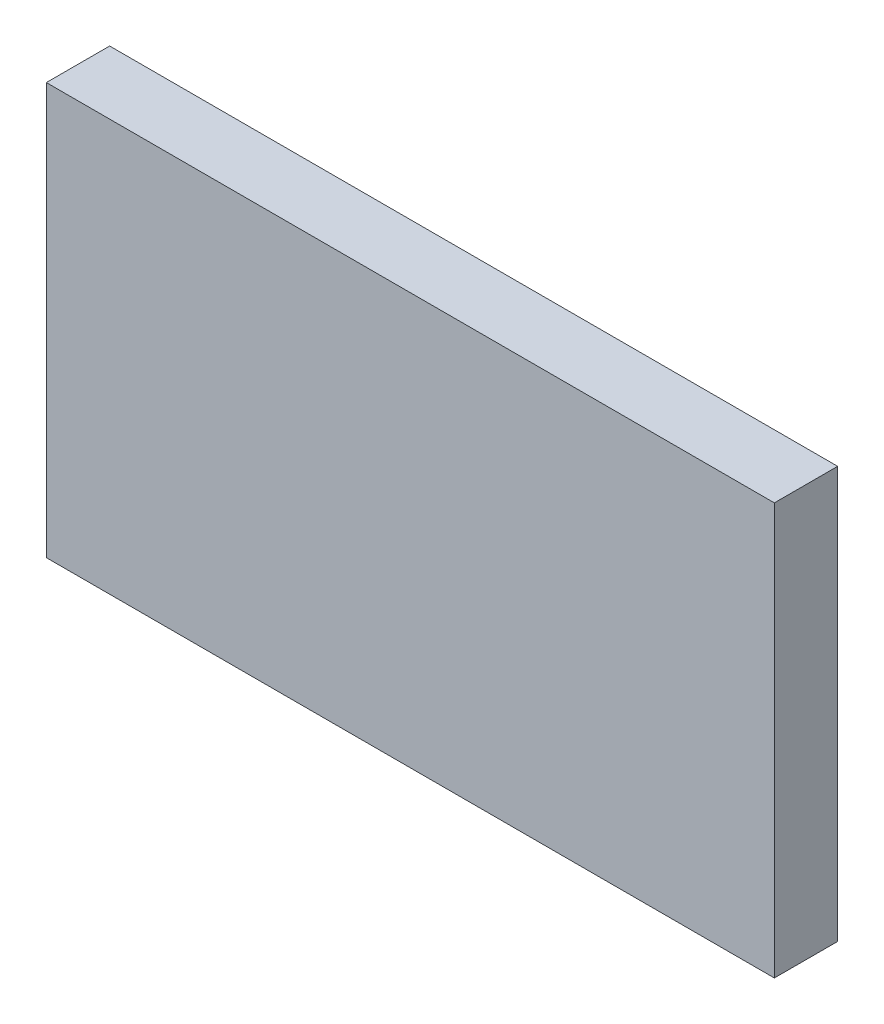
ISO-10303-21;
HEADER;
FILE_DESCRIPTION(('STEP AP214'),'2;1');
FILE_NAME('part.step','',(''),(''),'','','');
FILE_SCHEMA(('AUTOMOTIVE_DESIGN { 1 0 10303 214 1 1 1 1 }'));
ENDSEC;
DATA;
#1=APPLICATION_CONTEXT('core data for automotive mechanical design processes');
#2=APPLICATION_PROTOCOL_DEFINITION('international standard','automotive_design',2000,#1);
#3=PRODUCT_CONTEXT('',#1,'mechanical');
#4=PRODUCT('Part','Part','',(#3));
#5=PRODUCT_RELATED_PRODUCT_CATEGORY('part','',(#4));
#6=PRODUCT_DEFINITION_FORMATION('','',#4);
#7=PRODUCT_DEFINITION_CONTEXT('part definition',#1,'design');
#8=PRODUCT_DEFINITION('design','',#6,#7);
#9=PRODUCT_DEFINITION_SHAPE('','',#8);
#10=(LENGTH_UNIT() NAMED_UNIT(*) SI_UNIT(.MILLI.,.METRE.));
#11=(NAMED_UNIT(*) PLANE_ANGLE_UNIT() SI_UNIT($,.RADIAN.));
#12=(NAMED_UNIT(*) SI_UNIT($,.STERADIAN.) SOLID_ANGLE_UNIT());
#13=UNCERTAINTY_MEASURE_WITH_UNIT(LENGTH_MEASURE(1.E-05),#10,'distance_accuracy_value','');
#14=(GEOMETRIC_REPRESENTATION_CONTEXT(3) GLOBAL_UNCERTAINTY_ASSIGNED_CONTEXT((#13)) GLOBAL_UNIT_ASSIGNED_CONTEXT((#10,
#11,#12)) REPRESENTATION_CONTEXT('',''));
#15=CARTESIAN_POINT('',(0.,0.,0.));
#16=DIRECTION('',(0.,0.,1.));
#17=DIRECTION('',(1.,0.,0.));
#18=AXIS2_PLACEMENT_3D('',#15,#16,#17);
#19=CARTESIAN_POINT('',(11.5,-6.5,2.));
#20=DIRECTION('',(-1.,0.,0.));
#21=DIRECTION('',(0.,0.,1.));
#22=AXIS2_PLACEMENT_3D('',#19,#20,#21);
#23=PLANE('',#22);
#24=DIRECTION('',(0.,1.,0.));
#25=VECTOR('',#24,1.);
#26=CARTESIAN_POINT('',(11.5,-6.5,0.));
#27=LINE('',#26,#25);
#28=CARTESIAN_POINT('',(11.5,-6.5,0.));
#29=VERTEX_POINT('',#28);
#30=CARTESIAN_POINT('',(11.5,6.5,0.));
#31=VERTEX_POINT('',#30);
#32=EDGE_CURVE('E102',#29,#31,#27,.T.);
#33=ORIENTED_EDGE('',*,*,#32,.T.);
#34=DIRECTION('',(0.,0.,-1.));
#35=VECTOR('',#34,1.);
#36=CARTESIAN_POINT('',(11.5,6.5,2.));
#37=LINE('',#36,#35);
#38=CARTESIAN_POINT('',(11.5,6.5,2.));
#39=VERTEX_POINT('',#38);
#40=EDGE_CURVE('E11',#39,#31,#37,.T.);
#41=ORIENTED_EDGE('',*,*,#40,.F.);
#42=DIRECTION('',(0.,1.,0.));
#43=VECTOR('',#42,1.);
#44=CARTESIAN_POINT('',(11.5,-6.5,2.));
#45=LINE('',#44,#43);
#46=CARTESIAN_POINT('',(11.5,-6.5,2.));
#47=VERTEX_POINT('',#46);
#48=EDGE_CURVE('E90',#47,#39,#45,.T.);
#49=ORIENTED_EDGE('',*,*,#48,.F.);
#50=DIRECTION('',(0.,0.,-1.));
#51=VECTOR('',#50,1.);
#52=CARTESIAN_POINT('',(11.5,-6.5,2.));
#53=LINE('',#52,#51);
#54=EDGE_CURVE('E98',#47,#29,#53,.T.);
#55=ORIENTED_EDGE('',*,*,#54,.T.);
#56=EDGE_LOOP('',(#33,#41,#49,#55));
#57=FACE_BOUND('',#56,.T.);
#58=ADVANCED_FACE('F39',(#57),#23,.F.);
#59=CARTESIAN_POINT('',(-11.5,6.5,2.));
#60=DIRECTION('',(0.,-1.,0.));
#61=DIRECTION('',(0.,0.,-1.));
#62=AXIS2_PLACEMENT_3D('',#59,#60,#61);
#63=PLANE('',#62);
#64=DIRECTION('',(-1.,0.,0.));
#65=VECTOR('',#64,1.);
#66=CARTESIAN_POINT('',(-11.5,6.5,0.));
#67=LINE('',#66,#65);
#68=CARTESIAN_POINT('',(-11.5,6.5,0.));
#69=VERTEX_POINT('',#68);
#70=EDGE_CURVE('E94',#31,#69,#67,.T.);
#71=ORIENTED_EDGE('',*,*,#70,.T.);
#72=DIRECTION('',(0.,0.,-1.));
#73=VECTOR('',#72,1.);
#74=CARTESIAN_POINT('',(-11.5,6.5,2.));
#75=LINE('',#74,#73);
#76=CARTESIAN_POINT('',(-11.5,6.5,2.));
#77=VERTEX_POINT('',#76);
#78=EDGE_CURVE('E47',#77,#69,#75,.T.);
#79=ORIENTED_EDGE('',*,*,#78,.F.);
#80=DIRECTION('',(-1.,0.,0.));
#81=VECTOR('',#80,1.);
#82=CARTESIAN_POINT('',(-11.5,6.5,2.));
#83=LINE('',#82,#81);
#84=EDGE_CURVE('E85',#39,#77,#83,.T.);
#85=ORIENTED_EDGE('',*,*,#84,.F.);
#86=ORIENTED_EDGE('',*,*,#40,.T.);
#87=EDGE_LOOP('',(#71,#79,#85,#86));
#88=FACE_BOUND('',#87,.T.);
#89=ADVANCED_FACE('F93',(#88),#63,.F.);
#90=CARTESIAN_POINT('',(-11.5,-6.5,2.));
#91=DIRECTION('',(1.,0.,0.));
#92=DIRECTION('',(0.,0.,-1.));
#93=AXIS2_PLACEMENT_3D('',#90,#91,#92);
#94=PLANE('',#93);
#95=DIRECTION('',(0.,-1.,0.));
#96=VECTOR('',#95,1.);
#97=CARTESIAN_POINT('',(-11.5,-6.5,0.));
#98=LINE('',#97,#96);
#99=CARTESIAN_POINT('',(-11.5,-6.5,0.));
#100=VERTEX_POINT('',#99);
#101=EDGE_CURVE('E72',#69,#100,#98,.T.);
#102=ORIENTED_EDGE('',*,*,#101,.T.);
#103=DIRECTION('',(0.,0.,-1.));
#104=VECTOR('',#103,1.);
#105=CARTESIAN_POINT('',(-11.5,-6.5,2.));
#106=LINE('',#105,#104);
#107=CARTESIAN_POINT('',(-11.5,-6.5,2.));
#108=VERTEX_POINT('',#107);
#109=EDGE_CURVE('E95',#108,#100,#106,.T.);
#110=ORIENTED_EDGE('',*,*,#109,.F.);
#111=DIRECTION('',(0.,-1.,0.));
#112=VECTOR('',#111,1.);
#113=CARTESIAN_POINT('',(-11.5,-6.5,2.));
#114=LINE('',#113,#112);
#115=EDGE_CURVE('E88',#77,#108,#114,.T.);
#116=ORIENTED_EDGE('',*,*,#115,.F.);
#117=ORIENTED_EDGE('',*,*,#78,.T.);
#118=EDGE_LOOP('',(#102,#110,#116,#117));
#119=FACE_BOUND('',#118,.T.);
#120=ADVANCED_FACE('F96',(#119),#94,.F.);
#121=CARTESIAN_POINT('',(-11.5,-6.5,2.));
#122=DIRECTION('',(0.,1.,0.));
#123=DIRECTION('',(0.,0.,1.));
#124=AXIS2_PLACEMENT_3D('',#121,#122,#123);
#125=PLANE('',#124);
#126=DIRECTION('',(1.,0.,0.));
#127=VECTOR('',#126,1.);
#128=CARTESIAN_POINT('',(-11.5,-6.5,0.));
#129=LINE('',#128,#127);
#130=EDGE_CURVE('E78',#100,#29,#129,.T.);
#131=ORIENTED_EDGE('',*,*,#130,.T.);
#132=ORIENTED_EDGE('',*,*,#54,.F.);
#133=DIRECTION('',(1.,0.,0.));
#134=VECTOR('',#133,1.);
#135=CARTESIAN_POINT('',(-11.5,-6.5,2.));
#136=LINE('',#135,#134);
#137=EDGE_CURVE('E55',#108,#47,#136,.T.);
#138=ORIENTED_EDGE('',*,*,#137,.F.);
#139=ORIENTED_EDGE('',*,*,#109,.T.);
#140=EDGE_LOOP('',(#131,#132,#138,#139));
#141=FACE_BOUND('',#140,.T.);
#142=ADVANCED_FACE('F109',(#141),#125,.F.);
#143=CARTESIAN_POINT('',(0.,0.,2.));
#144=DIRECTION('',(0.,0.,-1.));
#145=DIRECTION('',(-1.,0.,0.));
#146=AXIS2_PLACEMENT_3D('',#143,#144,#145);
#147=PLANE('',#146);
#148=ORIENTED_EDGE('',*,*,#48,.T.);
#149=ORIENTED_EDGE('',*,*,#84,.T.);
#150=ORIENTED_EDGE('',*,*,#115,.T.);
#151=ORIENTED_EDGE('',*,*,#137,.T.);
#152=EDGE_LOOP('',(#148,#149,#150,#151));
#153=FACE_BOUND('',#152,.T.);
#154=ADVANCED_FACE('F86',(#153),#147,.F.);
#155=CARTESIAN_POINT('',(0.,0.,0.));
#156=DIRECTION('',(0.,0.,-1.));
#157=DIRECTION('',(-1.,0.,0.));
#158=AXIS2_PLACEMENT_3D('',#155,#156,#157);
#159=PLANE('',#158);
#160=ORIENTED_EDGE('',*,*,#32,.F.);
#161=ORIENTED_EDGE('',*,*,#130,.F.);
#162=ORIENTED_EDGE('',*,*,#101,.F.);
#163=ORIENTED_EDGE('',*,*,#70,.F.);
#164=EDGE_LOOP('',(#160,#161,#162,#163));
#165=FACE_BOUND('',#164,.T.);
#166=ADVANCED_FACE('F112',(#165),#159,.T.);
#167=CLOSED_SHELL('',(#58,#89,#120,#142,#154,#166));
#168=MANIFOLD_SOLID_BREP('B2',#167);
#169=ADVANCED_BREP_SHAPE_REPRESENTATION('',(#18,#168),#14);
#170=SHAPE_DEFINITION_REPRESENTATION(#9,#169);
ENDSEC;
END-ISO-10303-21;
